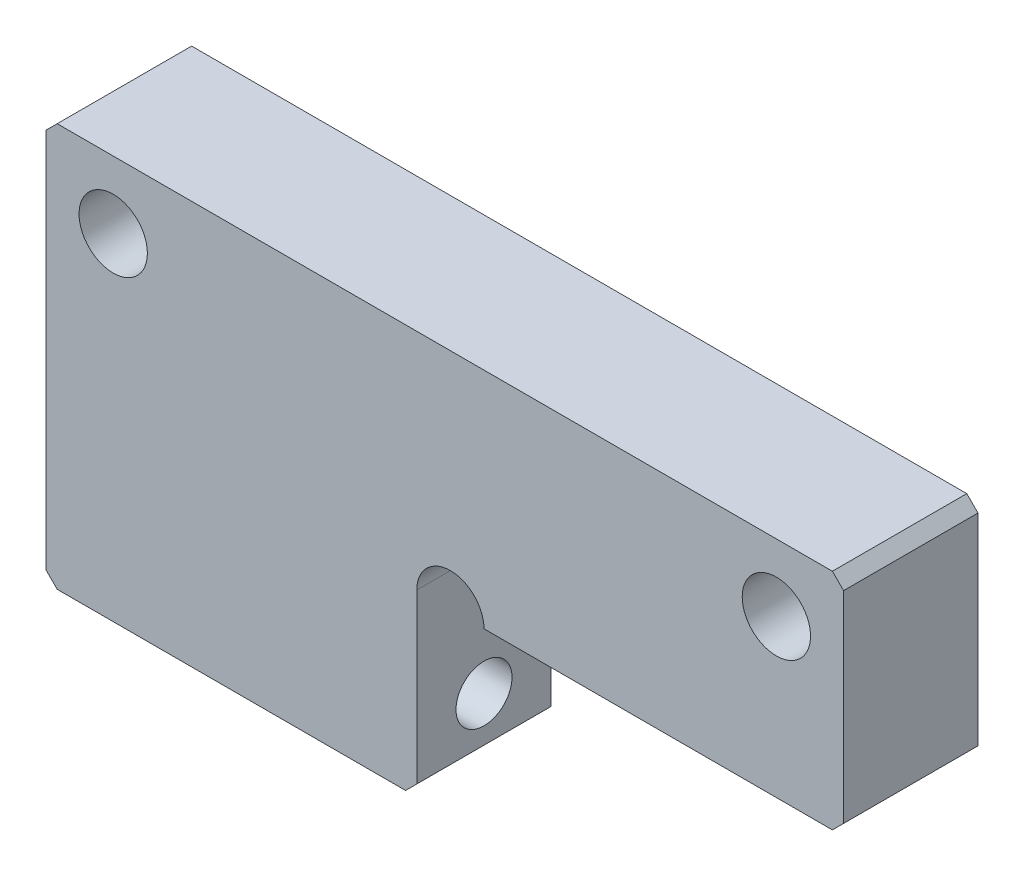
ISO-10303-21;
HEADER;
FILE_DESCRIPTION(('STEP AP214'),'2;1');
FILE_NAME('part.step','',(''),(''),'','','');
FILE_SCHEMA(('AUTOMOTIVE_DESIGN { 1 0 10303 214 1 1 1 1 }'));
ENDSEC;
DATA;
#1=APPLICATION_CONTEXT('core data for automotive mechanical design processes');
#2=APPLICATION_PROTOCOL_DEFINITION('international standard','automotive_design',2000,#1);
#3=PRODUCT_CONTEXT('',#1,'mechanical');
#4=PRODUCT('Part','Part','',(#3));
#5=PRODUCT_RELATED_PRODUCT_CATEGORY('part','',(#4));
#6=PRODUCT_DEFINITION_FORMATION('','',#4);
#7=PRODUCT_DEFINITION_CONTEXT('part definition',#1,'design');
#8=PRODUCT_DEFINITION('design','',#6,#7);
#9=PRODUCT_DEFINITION_SHAPE('','',#8);
#10=(LENGTH_UNIT() NAMED_UNIT(*) SI_UNIT(.MILLI.,.METRE.));
#11=(NAMED_UNIT(*) PLANE_ANGLE_UNIT() SI_UNIT($,.RADIAN.));
#12=(NAMED_UNIT(*) SI_UNIT($,.STERADIAN.) SOLID_ANGLE_UNIT());
#13=UNCERTAINTY_MEASURE_WITH_UNIT(LENGTH_MEASURE(1.E-05),#10,'distance_accuracy_value','');
#14=(GEOMETRIC_REPRESENTATION_CONTEXT(3) GLOBAL_UNCERTAINTY_ASSIGNED_CONTEXT((#13)) GLOBAL_UNIT_ASSIGNED_CONTEXT((#10,
#11,#12)) REPRESENTATION_CONTEXT('',''));
#15=CARTESIAN_POINT('',(0.,0.,0.));
#16=DIRECTION('',(0.,0.,1.));
#17=DIRECTION('',(1.,0.,0.));
#18=AXIS2_PLACEMENT_3D('',#15,#16,#17);
#19=CARTESIAN_POINT('',(-17.8,-9.,6.));
#20=DIRECTION('',(0.,1.,0.));
#21=DIRECTION('',(0.,0.,1.));
#22=AXIS2_PLACEMENT_3D('',#19,#20,#21);
#23=PLANE('',#22);
#24=DIRECTION('',(1.,0.,0.));
#25=VECTOR('',#24,1.);
#26=CARTESIAN_POINT('',(-17.8,-9.,6.));
#27=LINE('',#26,#25);
#28=CARTESIAN_POINT('',(-17.3,-9.,6.));
#29=VERTEX_POINT('',#28);
#30=CARTESIAN_POINT('',(-1.75000000000001,-9.,6.));
#31=VERTEX_POINT('',#30);
#32=EDGE_CURVE('E177',#29,#31,#27,.T.);
#33=ORIENTED_EDGE('',*,*,#32,.F.);
#34=DIRECTION('',(0.,0.,-1.));
#35=VECTOR('',#34,1.);
#36=CARTESIAN_POINT('',(-17.3,-9.,6.));
#37=LINE('',#36,#35);
#38=CARTESIAN_POINT('',(-17.3,-9.,0.));
#39=VERTEX_POINT('',#38);
#40=EDGE_CURVE('E263',#29,#39,#37,.T.);
#41=ORIENTED_EDGE('',*,*,#40,.T.);
#42=DIRECTION('',(1.,0.,0.));
#43=VECTOR('',#42,1.);
#44=CARTESIAN_POINT('',(-17.8,-9.,0.));
#45=LINE('',#44,#43);
#46=CARTESIAN_POINT('',(-1.75000000000001,-9.,0.));
#47=VERTEX_POINT('',#46);
#48=EDGE_CURVE('E169',#39,#47,#45,.T.);
#49=ORIENTED_EDGE('',*,*,#48,.T.);
#50=DIRECTION('',(0.,0.,1.));
#51=VECTOR('',#50,1.);
#52=CARTESIAN_POINT('',(-1.75000000000001,-9.,6.));
#53=LINE('',#52,#51);
#54=EDGE_CURVE('E259',#47,#31,#53,.T.);
#55=ORIENTED_EDGE('',*,*,#54,.T.);
#56=EDGE_LOOP('',(#33,#41,#49,#55));
#57=FACE_BOUND('',#56,.T.);
#58=ADVANCED_FACE('F46',(#57),#23,.F.);
#59=CARTESIAN_POINT('',(17.8,-9.,6.));
#60=DIRECTION('',(-1.,0.,0.));
#61=DIRECTION('',(0.,0.,1.));
#62=AXIS2_PLACEMENT_3D('',#59,#60,#61);
#63=PLANE('',#62);
#64=DIRECTION('',(0.,1.,0.));
#65=VECTOR('',#64,1.);
#66=CARTESIAN_POINT('',(17.8,-9.,6.));
#67=LINE('',#66,#65);
#68=CARTESIAN_POINT('',(17.8,-0.500000000000004,6.));
#69=VERTEX_POINT('',#68);
#70=CARTESIAN_POINT('',(17.8,8.49999999999999,6.));
#71=VERTEX_POINT('',#70);
#72=EDGE_CURVE('E164',#69,#71,#67,.T.);
#73=ORIENTED_EDGE('',*,*,#72,.F.);
#74=DIRECTION('',(0.,0.,-1.));
#75=VECTOR('',#74,1.);
#76=CARTESIAN_POINT('',(17.8,-0.500000000000004,6.));
#77=LINE('',#76,#75);
#78=CARTESIAN_POINT('',(17.8,-0.500000000000004,0.));
#79=VERTEX_POINT('',#78);
#80=EDGE_CURVE('E210',#69,#79,#77,.T.);
#81=ORIENTED_EDGE('',*,*,#80,.T.);
#82=DIRECTION('',(0.,1.,0.));
#83=VECTOR('',#82,1.);
#84=CARTESIAN_POINT('',(17.8,-9.,0.));
#85=LINE('',#84,#83);
#86=CARTESIAN_POINT('',(17.8,8.49999999999999,0.));
#87=VERTEX_POINT('',#86);
#88=EDGE_CURVE('E157',#79,#87,#85,.T.);
#89=ORIENTED_EDGE('',*,*,#88,.T.);
#90=DIRECTION('',(0.,0.,1.));
#91=VECTOR('',#90,1.);
#92=CARTESIAN_POINT('',(17.8,8.49999999999999,6.));
#93=LINE('',#92,#91);
#94=EDGE_CURVE('E197',#87,#71,#93,.T.);
#95=ORIENTED_EDGE('',*,*,#94,.T.);
#96=EDGE_LOOP('',(#73,#81,#89,#95));
#97=FACE_BOUND('',#96,.T.);
#98=ADVANCED_FACE('F306',(#97),#63,.F.);
#99=CARTESIAN_POINT('',(-17.8,9.,6.));
#100=DIRECTION('',(0.,-1.,0.));
#101=DIRECTION('',(0.,0.,-1.));
#102=AXIS2_PLACEMENT_3D('',#99,#100,#101);
#103=PLANE('',#102);
#104=DIRECTION('',(-1.,0.,0.));
#105=VECTOR('',#104,1.);
#106=CARTESIAN_POINT('',(-17.8,9.,6.));
#107=LINE('',#106,#105);
#108=CARTESIAN_POINT('',(17.3,9.,6.));
#109=VERTEX_POINT('',#108);
#110=CARTESIAN_POINT('',(-17.3,9.,6.));
#111=VERTEX_POINT('',#110);
#112=EDGE_CURVE('E168',#109,#111,#107,.T.);
#113=ORIENTED_EDGE('',*,*,#112,.F.);
#114=DIRECTION('',(0.,0.,-1.));
#115=VECTOR('',#114,1.);
#116=CARTESIAN_POINT('',(17.3,9.,6.));
#117=LINE('',#116,#115);
#118=CARTESIAN_POINT('',(17.3,9.,0.));
#119=VERTEX_POINT('',#118);
#120=EDGE_CURVE('E248',#109,#119,#117,.T.);
#121=ORIENTED_EDGE('',*,*,#120,.T.);
#122=DIRECTION('',(-1.,0.,0.));
#123=VECTOR('',#122,1.);
#124=CARTESIAN_POINT('',(-17.8,9.,0.));
#125=LINE('',#124,#123);
#126=CARTESIAN_POINT('',(-17.3,9.,0.));
#127=VERTEX_POINT('',#126);
#128=EDGE_CURVE('E183',#119,#127,#125,.T.);
#129=ORIENTED_EDGE('',*,*,#128,.T.);
#130=DIRECTION('',(0.,0.,1.));
#131=VECTOR('',#130,1.);
#132=CARTESIAN_POINT('',(-17.3,9.,6.));
#133=LINE('',#132,#131);
#134=EDGE_CURVE('E245',#127,#111,#133,.T.);
#135=ORIENTED_EDGE('',*,*,#134,.T.);
#136=EDGE_LOOP('',(#113,#121,#129,#135));
#137=FACE_BOUND('',#136,.T.);
#138=ADVANCED_FACE('F297',(#137),#103,.F.);
#139=CARTESIAN_POINT('',(-17.8,-9.,6.));
#140=DIRECTION('',(1.,0.,0.));
#141=DIRECTION('',(0.,0.,-1.));
#142=AXIS2_PLACEMENT_3D('',#139,#140,#141);
#143=PLANE('',#142);
#144=CARTESIAN_POINT('',(-17.8,-6.5,3.));
#145=DIRECTION('',(1.,0.,0.));
#146=DIRECTION('',(0.,0.,-1.));
#147=AXIS2_PLACEMENT_3D('',#144,#145,#146);
#148=CIRCLE('',#147,1.25);
#149=CARTESIAN_POINT('',(-17.8,-6.5,1.75));
#150=VERTEX_POINT('',#149);
#151=EDGE_CURVE('E311',#150,#150,#148,.T.);
#152=ORIENTED_EDGE('',*,*,#151,.T.);
#153=EDGE_LOOP('',(#152));
#154=FACE_BOUND('',#153,.T.);
#155=DIRECTION('',(0.,-1.,0.));
#156=VECTOR('',#155,1.);
#157=CARTESIAN_POINT('',(-17.8,-9.,6.));
#158=LINE('',#157,#156);
#159=CARTESIAN_POINT('',(-17.8,8.5,6.));
#160=VERTEX_POINT('',#159);
#161=CARTESIAN_POINT('',(-17.8,-8.49999999999999,6.));
#162=VERTEX_POINT('',#161);
#163=EDGE_CURVE('E173',#160,#162,#158,.T.);
#164=ORIENTED_EDGE('',*,*,#163,.F.);
#165=DIRECTION('',(0.,0.,-1.));
#166=VECTOR('',#165,1.);
#167=CARTESIAN_POINT('',(-17.8,8.5,6.));
#168=LINE('',#167,#166);
#169=CARTESIAN_POINT('',(-17.8,8.5,0.));
#170=VERTEX_POINT('',#169);
#171=EDGE_CURVE('E255',#160,#170,#168,.T.);
#172=ORIENTED_EDGE('',*,*,#171,.T.);
#173=DIRECTION('',(0.,-1.,0.));
#174=VECTOR('',#173,1.);
#175=CARTESIAN_POINT('',(-17.8,-9.,0.));
#176=LINE('',#175,#174);
#177=CARTESIAN_POINT('',(-17.8,-8.49999999999999,0.));
#178=VERTEX_POINT('',#177);
#179=EDGE_CURVE('E187',#170,#178,#176,.T.);
#180=ORIENTED_EDGE('',*,*,#179,.T.);
#181=DIRECTION('',(0.,0.,1.));
#182=VECTOR('',#181,1.);
#183=CARTESIAN_POINT('',(-17.8,-8.49999999999999,6.));
#184=LINE('',#183,#182);
#185=EDGE_CURVE('E252',#178,#162,#184,.T.);
#186=ORIENTED_EDGE('',*,*,#185,.T.);
#187=EDGE_LOOP('',(#164,#172,#180,#186));
#188=FACE_BOUND('',#187,.T.);
#189=ADVANCED_FACE('F288',(#154,#188),#143,.F.);
#190=CARTESIAN_POINT('',(0.,0.,6.));
#191=DIRECTION('',(0.,0.,-1.));
#192=DIRECTION('',(-1.,0.,0.));
#193=AXIS2_PLACEMENT_3D('',#190,#191,#192);
#194=PLANE('',#193);
#195=CARTESIAN_POINT('',(-14.8,6.,6.));
#196=DIRECTION('',(0.,0.,1.));
#197=DIRECTION('',(1.,0.,0.));
#198=AXIS2_PLACEMENT_3D('',#195,#196,#197);
#199=CIRCLE('',#198,1.525);
#200=CARTESIAN_POINT('',(-13.275,6.,6.));
#201=VERTEX_POINT('',#200);
#202=EDGE_CURVE('E203',#201,#201,#199,.T.);
#203=ORIENTED_EDGE('',*,*,#202,.F.);
#204=EDGE_LOOP('',(#203));
#205=FACE_BOUND('',#204,.T.);
#206=CARTESIAN_POINT('',(14.8,6.,6.));
#207=DIRECTION('',(0.,0.,1.));
#208=DIRECTION('',(-1.,0.,0.));
#209=AXIS2_PLACEMENT_3D('',#206,#207,#208);
#210=CIRCLE('',#209,1.525);
#211=CARTESIAN_POINT('',(13.275,6.,6.));
#212=VERTEX_POINT('',#211);
#213=EDGE_CURVE('E319',#212,#212,#210,.T.);
#214=ORIENTED_EDGE('',*,*,#213,.F.);
#215=EDGE_LOOP('',(#214));
#216=FACE_BOUND('',#215,.T.);
#217=DIRECTION('',(0.,1.,0.));
#218=VECTOR('',#217,1.);
#219=CARTESIAN_POINT('',(-1.25,0.,6.));
#220=LINE('',#219,#218);
#221=CARTESIAN_POINT('',(-1.25,-8.49999999999999,6.));
#222=VERTEX_POINT('',#221);
#223=CARTESIAN_POINT('',(-1.25,-0.999999999999997,6.));
#224=VERTEX_POINT('',#223);
#225=EDGE_CURVE('E143',#222,#224,#220,.T.);
#226=ORIENTED_EDGE('',*,*,#225,.T.);
#227=CARTESIAN_POINT('',(0.25,-0.999999999999998,6.));
#228=DIRECTION('',(0.,0.,1.));
#229=DIRECTION('',(1.,0.,0.));
#230=AXIS2_PLACEMENT_3D('',#227,#228,#229);
#231=CIRCLE('',#230,1.5);
#232=CARTESIAN_POINT('',(1.75,-0.999999999999998,6.));
#233=VERTEX_POINT('',#232);
#234=EDGE_CURVE('E136',#233,#224,#231,.T.);
#235=ORIENTED_EDGE('',*,*,#234,.F.);
#236=DIRECTION('',(1.,0.,0.));
#237=VECTOR('',#236,1.);
#238=CARTESIAN_POINT('',(0.,-0.999999999999998,6.));
#239=LINE('',#238,#237);
#240=CARTESIAN_POINT('',(17.3,-1.,6.));
#241=VERTEX_POINT('',#240);
#242=EDGE_CURVE('E141',#233,#241,#239,.T.);
#243=ORIENTED_EDGE('',*,*,#242,.T.);
#244=DIRECTION('',(-0.70710678118655,-0.707106781186545,0.));
#245=VECTOR('',#244,1.);
#246=CARTESIAN_POINT('',(17.8,-0.500000000000004,6.));
#247=LINE('',#246,#245);
#248=EDGE_CURVE('E242',#241,#69,#247,.F.);
#249=ORIENTED_EDGE('',*,*,#248,.T.);
#250=ORIENTED_EDGE('',*,*,#72,.T.);
#251=DIRECTION('',(0.707106781186543,-0.707106781186552,0.));
#252=VECTOR('',#251,1.);
#253=CARTESIAN_POINT('',(17.3,9.,6.));
#254=LINE('',#253,#252);
#255=EDGE_CURVE('E239',#71,#109,#254,.F.);
#256=ORIENTED_EDGE('',*,*,#255,.T.);
#257=ORIENTED_EDGE('',*,*,#112,.T.);
#258=DIRECTION('',(0.70710678118655,0.707106781186545,0.));
#259=VECTOR('',#258,1.);
#260=CARTESIAN_POINT('',(-17.8,8.5,6.));
#261=LINE('',#260,#259);
#262=EDGE_CURVE('E236',#111,#160,#261,.F.);
#263=ORIENTED_EDGE('',*,*,#262,.T.);
#264=ORIENTED_EDGE('',*,*,#163,.T.);
#265=DIRECTION('',(-0.707106781186543,0.707106781186552,0.));
#266=VECTOR('',#265,1.);
#267=CARTESIAN_POINT('',(-17.3,-9.,6.));
#268=LINE('',#267,#266);
#269=EDGE_CURVE('E233',#162,#29,#268,.F.);
#270=ORIENTED_EDGE('',*,*,#269,.T.);
#271=ORIENTED_EDGE('',*,*,#32,.T.);
#272=DIRECTION('',(-0.707106781186548,-0.707106781186547,0.));
#273=VECTOR('',#272,1.);
#274=CARTESIAN_POINT('',(-1.75000000000001,-9.,6.));
#275=LINE('',#274,#273);
#276=EDGE_CURVE('E70',#31,#222,#275,.F.);
#277=ORIENTED_EDGE('',*,*,#276,.T.);
#278=EDGE_LOOP('',(#226,#235,#243,#249,#250,#256,#257,#263,#264,#270,#271,#277));
#279=FACE_BOUND('',#278,.T.);
#280=ADVANCED_FACE('F140',(#205,#216,#279),#194,.F.);
#281=CARTESIAN_POINT('',(0.,0.,0.));
#282=DIRECTION('',(0.,0.,-1.));
#283=DIRECTION('',(-1.,0.,0.));
#284=AXIS2_PLACEMENT_3D('',#281,#282,#283);
#285=PLANE('',#284);
#286=CARTESIAN_POINT('',(0.25,-0.999999999999998,0.));
#287=DIRECTION('',(0.,0.,-1.));
#288=DIRECTION('',(-1.,0.,0.));
#289=AXIS2_PLACEMENT_3D('',#286,#287,#288);
#290=CIRCLE('',#289,1.5);
#291=CARTESIAN_POINT('',(-1.25,-0.999999999999998,0.));
#292=VERTEX_POINT('',#291);
#293=CARTESIAN_POINT('',(1.75,-0.999999999999998,0.));
#294=VERTEX_POINT('',#293);
#295=EDGE_CURVE('E63',#292,#294,#290,.T.);
#296=ORIENTED_EDGE('',*,*,#295,.F.);
#297=DIRECTION('',(0.,1.,0.));
#298=VECTOR('',#297,1.);
#299=CARTESIAN_POINT('',(-1.25,0.,0.));
#300=LINE('',#299,#298);
#301=CARTESIAN_POINT('',(-1.25,-8.49999999999999,0.));
#302=VERTEX_POINT('',#301);
#303=EDGE_CURVE('E179',#302,#292,#300,.T.);
#304=ORIENTED_EDGE('',*,*,#303,.F.);
#305=DIRECTION('',(0.707106781186548,0.707106781186547,0.));
#306=VECTOR('',#305,1.);
#307=CARTESIAN_POINT('',(3.625,-3.62500000000001,0.));
#308=LINE('',#307,#306);
#309=EDGE_CURVE('E214',#302,#47,#308,.F.);
#310=ORIENTED_EDGE('',*,*,#309,.T.);
#311=ORIENTED_EDGE('',*,*,#48,.F.);
#312=DIRECTION('',(0.707106781186543,-0.707106781186552,0.));
#313=VECTOR('',#312,1.);
#314=CARTESIAN_POINT('',(-13.1500000000001,-13.1499999999999,0.));
#315=LINE('',#314,#313);
#316=EDGE_CURVE('E217',#39,#178,#315,.F.);
#317=ORIENTED_EDGE('',*,*,#316,.T.);
#318=ORIENTED_EDGE('',*,*,#179,.F.);
#319=DIRECTION('',(-0.70710678118655,-0.707106781186545,0.));
#320=VECTOR('',#319,1.);
#321=CARTESIAN_POINT('',(-13.1499999999999,13.15,0.));
#322=LINE('',#321,#320);
#323=EDGE_CURVE('E220',#170,#127,#322,.F.);
#324=ORIENTED_EDGE('',*,*,#323,.T.);
#325=ORIENTED_EDGE('',*,*,#128,.F.);
#326=DIRECTION('',(-0.707106781186543,0.707106781186552,0.));
#327=VECTOR('',#326,1.);
#328=CARTESIAN_POINT('',(13.1500000000001,13.1499999999999,0.));
#329=LINE('',#328,#327);
#330=EDGE_CURVE('E223',#119,#87,#329,.F.);
#331=ORIENTED_EDGE('',*,*,#330,.T.);
#332=ORIENTED_EDGE('',*,*,#88,.F.);
#333=DIRECTION('',(0.70710678118655,0.707106781186545,0.));
#334=VECTOR('',#333,1.);
#335=CARTESIAN_POINT('',(9.14999999999994,-9.15,0.));
#336=LINE('',#335,#334);
#337=CARTESIAN_POINT('',(17.3,-1.,0.));
#338=VERTEX_POINT('',#337);
#339=EDGE_CURVE('E226',#79,#338,#336,.F.);
#340=ORIENTED_EDGE('',*,*,#339,.T.);
#341=DIRECTION('',(1.,0.,0.));
#342=VECTOR('',#341,1.);
#343=CARTESIAN_POINT('',(1.25,-0.999999999999998,0.));
#344=LINE('',#343,#342);
#345=EDGE_CURVE('E160',#294,#338,#344,.T.);
#346=ORIENTED_EDGE('',*,*,#345,.F.);
#347=EDGE_LOOP('',(#296,#304,#310,#311,#317,#318,#324,#325,#331,#332,#340,#346));
#348=FACE_BOUND('',#347,.T.);
#349=CARTESIAN_POINT('',(-14.8,6.,0.));
#350=DIRECTION('',(0.,0.,-1.));
#351=DIRECTION('',(-1.,0.,0.));
#352=AXIS2_PLACEMENT_3D('',#349,#350,#351);
#353=CIRCLE('',#352,1.525);
#354=CARTESIAN_POINT('',(-16.325,6.,0.));
#355=VERTEX_POINT('',#354);
#356=EDGE_CURVE('E202',#355,#355,#353,.T.);
#357=ORIENTED_EDGE('',*,*,#356,.F.);
#358=EDGE_LOOP('',(#357));
#359=FACE_BOUND('',#358,.T.);
#360=CARTESIAN_POINT('',(14.8,6.,0.));
#361=DIRECTION('',(0.,0.,-1.));
#362=DIRECTION('',(-1.,0.,0.));
#363=AXIS2_PLACEMENT_3D('',#360,#361,#362);
#364=CIRCLE('',#363,1.525);
#365=CARTESIAN_POINT('',(13.275,6.,0.));
#366=VERTEX_POINT('',#365);
#367=EDGE_CURVE('E198',#366,#366,#364,.T.);
#368=ORIENTED_EDGE('',*,*,#367,.F.);
#369=EDGE_LOOP('',(#368));
#370=FACE_BOUND('',#369,.T.);
#371=ADVANCED_FACE('F274',(#348,#359,#370),#285,.T.);
#372=CARTESIAN_POINT('',(-1.25,-17.,28.));
#373=DIRECTION('',(-1.,0.,0.));
#374=DIRECTION('',(0.,0.,1.));
#375=AXIS2_PLACEMENT_3D('',#372,#373,#374);
#376=PLANE('',#375);
#377=CARTESIAN_POINT('',(-1.25,-6.5,3.));
#378=DIRECTION('',(1.,0.,0.));
#379=DIRECTION('',(0.,0.,-1.));
#380=AXIS2_PLACEMENT_3D('',#377,#378,#379);
#381=CIRCLE('',#380,1.24999999999999);
#382=CARTESIAN_POINT('',(-1.25,-6.5,1.75000000000001));
#383=VERTEX_POINT('',#382);
#384=EDGE_CURVE('E207',#383,#383,#381,.T.);
#385=ORIENTED_EDGE('',*,*,#384,.F.);
#386=EDGE_LOOP('',(#385));
#387=FACE_BOUND('',#386,.T.);
#388=ORIENTED_EDGE('',*,*,#225,.F.);
#389=DIRECTION('',(0.,0.,-1.));
#390=VECTOR('',#389,1.);
#391=CARTESIAN_POINT('',(-1.25,-8.49999999999999,28.));
#392=LINE('',#391,#390);
#393=EDGE_CURVE('E56',#222,#302,#392,.T.);
#394=ORIENTED_EDGE('',*,*,#393,.T.);
#395=ORIENTED_EDGE('',*,*,#303,.T.);
#396=DIRECTION('',(0.,0.,-1.));
#397=VECTOR('',#396,1.);
#398=CARTESIAN_POINT('',(-1.25,-0.999999999999997,28.));
#399=LINE('',#398,#397);
#400=EDGE_CURVE('E152',#224,#292,#399,.T.);
#401=ORIENTED_EDGE('',*,*,#400,.F.);
#402=EDGE_LOOP('',(#388,#394,#395,#401));
#403=FACE_BOUND('',#402,.T.);
#404=ADVANCED_FACE('F270',(#387,#403),#376,.F.);
#405=CARTESIAN_POINT('',(1.25,-0.999999999999998,28.));
#406=DIRECTION('',(0.,1.,0.));
#407=DIRECTION('',(-1.,0.,0.));
#408=AXIS2_PLACEMENT_3D('',#405,#406,#407);
#409=PLANE('',#408);
#410=ORIENTED_EDGE('',*,*,#242,.F.);
#411=DIRECTION('',(0.,0.,1.));
#412=VECTOR('',#411,1.);
#413=CARTESIAN_POINT('',(1.75,-0.999999999999998,-4.));
#414=LINE('',#413,#412);
#415=EDGE_CURVE('E11',#233,#294,#414,.F.);
#416=ORIENTED_EDGE('',*,*,#415,.T.);
#417=ORIENTED_EDGE('',*,*,#345,.T.);
#418=DIRECTION('',(0.,0.,1.));
#419=VECTOR('',#418,1.);
#420=CARTESIAN_POINT('',(17.3,-1.,28.));
#421=LINE('',#420,#419);
#422=EDGE_CURVE('E149',#338,#241,#421,.T.);
#423=ORIENTED_EDGE('',*,*,#422,.T.);
#424=EDGE_LOOP('',(#410,#416,#417,#423));
#425=FACE_BOUND('',#424,.T.);
#426=ADVANCED_FACE('F147',(#425),#409,.F.);
#427=CARTESIAN_POINT('',(-1.25,-6.5,3.));
#428=DIRECTION('',(1.,0.,0.));
#429=DIRECTION('',(0.,0.,-1.));
#430=AXIS2_PLACEMENT_3D('',#427,#428,#429);
#431=CYLINDRICAL_SURFACE('',#430,1.24999999999999);
#432=ORIENTED_EDGE('',*,*,#151,.F.);
#433=EDGE_LOOP('',(#432));
#434=FACE_BOUND('',#433,.T.);
#435=ORIENTED_EDGE('',*,*,#384,.T.);
#436=EDGE_LOOP('',(#435));
#437=FACE_BOUND('',#436,.T.);
#438=ADVANCED_FACE('F338',(#434,#437),#431,.F.);
#439=CARTESIAN_POINT('',(14.8,6.,-16.));
#440=DIRECTION('',(0.,0.,1.));
#441=DIRECTION('',(1.,0.,0.));
#442=AXIS2_PLACEMENT_3D('',#439,#440,#441);
#443=CYLINDRICAL_SURFACE('',#442,1.525);
#444=ORIENTED_EDGE('',*,*,#367,.T.);
#445=EDGE_LOOP('',(#444));
#446=FACE_BOUND('',#445,.T.);
#447=ORIENTED_EDGE('',*,*,#213,.T.);
#448=EDGE_LOOP('',(#447));
#449=FACE_BOUND('',#448,.T.);
#450=ADVANCED_FACE('F336',(#446,#449),#443,.F.);
#451=CARTESIAN_POINT('',(-14.8,6.,-16.));
#452=DIRECTION('',(0.,0.,1.));
#453=DIRECTION('',(1.,0.,0.));
#454=AXIS2_PLACEMENT_3D('',#451,#452,#453);
#455=CYLINDRICAL_SURFACE('',#454,1.525);
#456=ORIENTED_EDGE('',*,*,#356,.T.);
#457=EDGE_LOOP('',(#456));
#458=FACE_BOUND('',#457,.T.);
#459=ORIENTED_EDGE('',*,*,#202,.T.);
#460=EDGE_LOOP('',(#459));
#461=FACE_BOUND('',#460,.T.);
#462=ADVANCED_FACE('F329',(#458,#461),#455,.F.);
#463=CARTESIAN_POINT('',(17.8,-0.500000000000004,6.));
#464=DIRECTION('',(-0.707106781186545,0.70710678118655,0.));
#465=DIRECTION('',(0.,0.,-1.));
#466=AXIS2_PLACEMENT_3D('',#463,#464,#465);
#467=PLANE('',#466);
#468=ORIENTED_EDGE('',*,*,#248,.F.);
#469=ORIENTED_EDGE('',*,*,#422,.F.);
#470=ORIENTED_EDGE('',*,*,#339,.F.);
#471=ORIENTED_EDGE('',*,*,#80,.F.);
#472=EDGE_LOOP('',(#468,#469,#470,#471));
#473=FACE_BOUND('',#472,.T.);
#474=ADVANCED_FACE('F309',(#473),#467,.F.);
#475=CARTESIAN_POINT('',(17.3,9.,6.));
#476=DIRECTION('',(-0.707106781186552,-0.707106781186542,0.));
#477=DIRECTION('',(0.,0.,-1.));
#478=AXIS2_PLACEMENT_3D('',#475,#476,#477);
#479=PLANE('',#478);
#480=ORIENTED_EDGE('',*,*,#255,.F.);
#481=ORIENTED_EDGE('',*,*,#94,.F.);
#482=ORIENTED_EDGE('',*,*,#330,.F.);
#483=ORIENTED_EDGE('',*,*,#120,.F.);
#484=EDGE_LOOP('',(#480,#481,#482,#483));
#485=FACE_BOUND('',#484,.T.);
#486=ADVANCED_FACE('F301',(#485),#479,.F.);
#487=CARTESIAN_POINT('',(-17.8,8.5,6.));
#488=DIRECTION('',(0.707106781186545,-0.70710678118655,0.));
#489=DIRECTION('',(0.,0.,-1.));
#490=AXIS2_PLACEMENT_3D('',#487,#488,#489);
#491=PLANE('',#490);
#492=ORIENTED_EDGE('',*,*,#262,.F.);
#493=ORIENTED_EDGE('',*,*,#134,.F.);
#494=ORIENTED_EDGE('',*,*,#323,.F.);
#495=ORIENTED_EDGE('',*,*,#171,.F.);
#496=EDGE_LOOP('',(#492,#493,#494,#495));
#497=FACE_BOUND('',#496,.T.);
#498=ADVANCED_FACE('F292',(#497),#491,.F.);
#499=CARTESIAN_POINT('',(-17.3,-9.,6.));
#500=DIRECTION('',(0.707106781186552,0.707106781186542,0.));
#501=DIRECTION('',(0.,0.,-1.));
#502=AXIS2_PLACEMENT_3D('',#499,#500,#501);
#503=PLANE('',#502);
#504=ORIENTED_EDGE('',*,*,#269,.F.);
#505=ORIENTED_EDGE('',*,*,#185,.F.);
#506=ORIENTED_EDGE('',*,*,#316,.F.);
#507=ORIENTED_EDGE('',*,*,#40,.F.);
#508=EDGE_LOOP('',(#504,#505,#506,#507));
#509=FACE_BOUND('',#508,.T.);
#510=ADVANCED_FACE('F285',(#509),#503,.F.);
#511=CARTESIAN_POINT('',(-1.75000000000001,-9.,6.));
#512=DIRECTION('',(-0.707106781186547,0.707106781186548,0.));
#513=DIRECTION('',(0.,0.,1.));
#514=AXIS2_PLACEMENT_3D('',#511,#512,#513);
#515=PLANE('',#514);
#516=ORIENTED_EDGE('',*,*,#309,.F.);
#517=ORIENTED_EDGE('',*,*,#393,.F.);
#518=ORIENTED_EDGE('',*,*,#276,.F.);
#519=ORIENTED_EDGE('',*,*,#54,.F.);
#520=EDGE_LOOP('',(#516,#517,#518,#519));
#521=FACE_BOUND('',#520,.T.);
#522=ADVANCED_FACE('F49',(#521),#515,.F.);
#523=CARTESIAN_POINT('',(0.25,-0.999999999999998,-4.));
#524=DIRECTION('',(0.,0.,1.));
#525=DIRECTION('',(1.,0.,0.));
#526=AXIS2_PLACEMENT_3D('',#523,#524,#525);
#527=CYLINDRICAL_SURFACE('',#526,1.5);
#528=ORIENTED_EDGE('',*,*,#295,.T.);
#529=ORIENTED_EDGE('',*,*,#415,.F.);
#530=ORIENTED_EDGE('',*,*,#234,.T.);
#531=ORIENTED_EDGE('',*,*,#400,.T.);
#532=EDGE_LOOP('',(#528,#529,#530,#531));
#533=FACE_BOUND('',#532,.T.);
#534=ADVANCED_FACE('F135',(#533),#527,.F.);
#535=CLOSED_SHELL('',(#58,#98,#138,#189,#280,#371,#404,#426,#438,#450,#462,#474,#486,#498,#510,
#522,#534));
#536=MANIFOLD_SOLID_BREP('B2',#535);
#537=ADVANCED_BREP_SHAPE_REPRESENTATION('',(#18,#536),#14);
#538=SHAPE_DEFINITION_REPRESENTATION(#9,#537);
ENDSEC;
END-ISO-10303-21;
